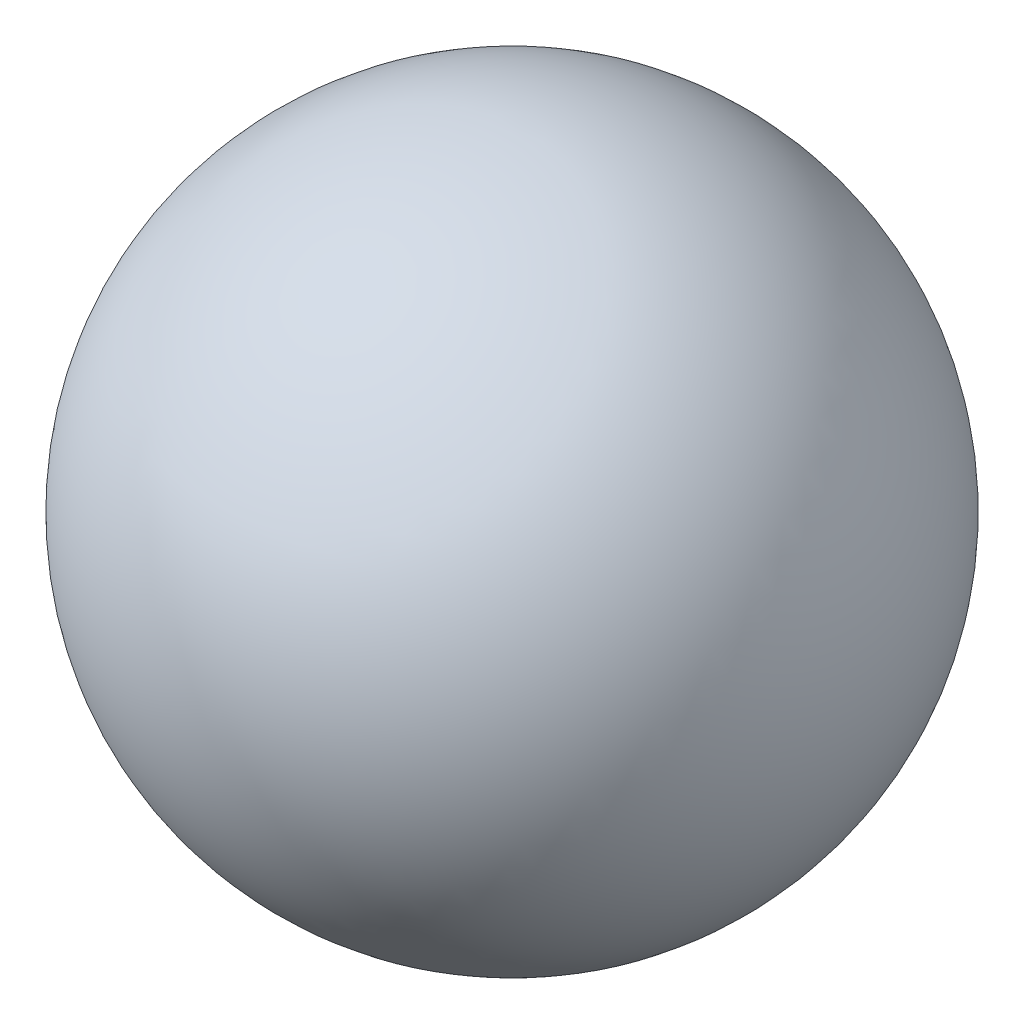
ISO-10303-21;
HEADER;
FILE_DESCRIPTION(('STEP AP214'),'2;1');
FILE_NAME('part.step','',(''),(''),'','','');
FILE_SCHEMA(('AUTOMOTIVE_DESIGN { 1 0 10303 214 1 1 1 1 }'));
ENDSEC;
DATA;
#1=APPLICATION_CONTEXT('core data for automotive mechanical design processes');
#2=APPLICATION_PROTOCOL_DEFINITION('international standard','automotive_design',2000,#1);
#3=PRODUCT_CONTEXT('',#1,'mechanical');
#4=PRODUCT('Part','Part','',(#3));
#5=PRODUCT_RELATED_PRODUCT_CATEGORY('part','',(#4));
#6=PRODUCT_DEFINITION_FORMATION('','',#4);
#7=PRODUCT_DEFINITION_CONTEXT('part definition',#1,'design');
#8=PRODUCT_DEFINITION('design','',#6,#7);
#9=PRODUCT_DEFINITION_SHAPE('','',#8);
#10=(LENGTH_UNIT() NAMED_UNIT(*) SI_UNIT(.MILLI.,.METRE.));
#11=(NAMED_UNIT(*) PLANE_ANGLE_UNIT() SI_UNIT($,.RADIAN.));
#12=(NAMED_UNIT(*) SI_UNIT($,.STERADIAN.) SOLID_ANGLE_UNIT());
#13=UNCERTAINTY_MEASURE_WITH_UNIT(LENGTH_MEASURE(1.E-05),#10,'distance_accuracy_value','');
#14=(GEOMETRIC_REPRESENTATION_CONTEXT(3) GLOBAL_UNCERTAINTY_ASSIGNED_CONTEXT((#13)) GLOBAL_UNIT_ASSIGNED_CONTEXT((#10,
#11,#12)) REPRESENTATION_CONTEXT('',''));
#15=CARTESIAN_POINT('',(0.,0.,0.));
#16=DIRECTION('',(0.,0.,1.));
#17=DIRECTION('',(1.,0.,0.));
#18=AXIS2_PLACEMENT_3D('',#15,#16,#17);
#19=CARTESIAN_POINT('',(0.,0.,0.));
#20=DIRECTION('',(0.,-1.,0.));
#21=DIRECTION('',(0.,0.,1.));
#22=AXIS2_PLACEMENT_3D('',#19,#20,#21);
#23=SPHERICAL_SURFACE('',#22,2.25);
#24=CARTESIAN_POINT('',(0.,-2.25,0.));
#25=VERTEX_POINT('',#24);
#26=VERTEX_LOOP('',#25);
#27=FACE_BOUND('',#26,.T.);
#28=ADVANCED_FACE('F32',(#27),#23,.T.);
#29=CLOSED_SHELL('',(#28));
#30=MANIFOLD_SOLID_BREP('B2',#29);
#31=ADVANCED_BREP_SHAPE_REPRESENTATION('',(#18,#30),#14);
#32=SHAPE_DEFINITION_REPRESENTATION(#9,#31);
ENDSEC;
END-ISO-10303-21;
